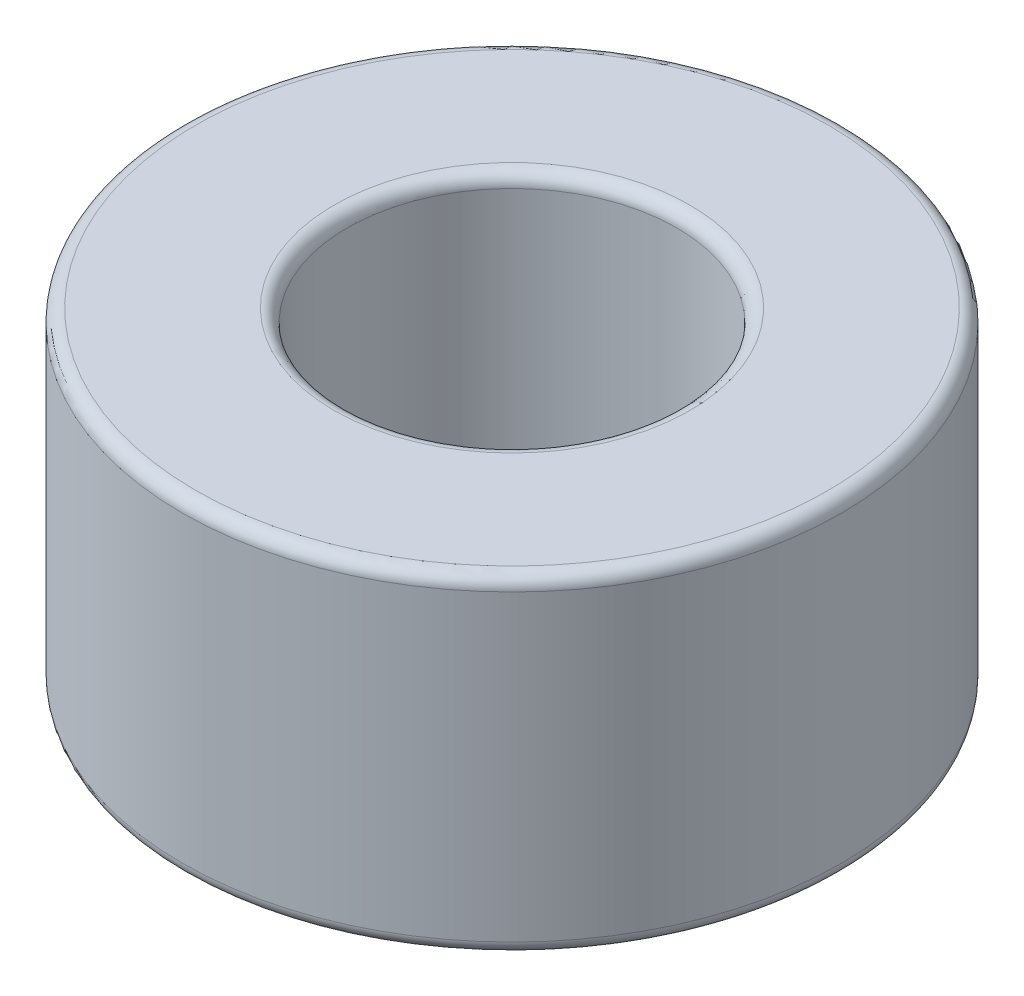
ISO-10303-21;
HEADER;
FILE_DESCRIPTION(('STEP AP214'),'2;1');
FILE_NAME('part.step','',(''),(''),'','','');
FILE_SCHEMA(('AUTOMOTIVE_DESIGN { 1 0 10303 214 1 1 1 1 }'));
ENDSEC;
DATA;
#1=APPLICATION_CONTEXT('core data for automotive mechanical design processes');
#2=APPLICATION_PROTOCOL_DEFINITION('international standard','automotive_design',2000,#1);
#3=PRODUCT_CONTEXT('',#1,'mechanical');
#4=PRODUCT('Part','Part','',(#3));
#5=PRODUCT_RELATED_PRODUCT_CATEGORY('part','',(#4));
#6=PRODUCT_DEFINITION_FORMATION('','',#4);
#7=PRODUCT_DEFINITION_CONTEXT('part definition',#1,'design');
#8=PRODUCT_DEFINITION('design','',#6,#7);
#9=PRODUCT_DEFINITION_SHAPE('','',#8);
#10=(LENGTH_UNIT() NAMED_UNIT(*) SI_UNIT(.MILLI.,.METRE.));
#11=(NAMED_UNIT(*) PLANE_ANGLE_UNIT() SI_UNIT($,.RADIAN.));
#12=(NAMED_UNIT(*) SI_UNIT($,.STERADIAN.) SOLID_ANGLE_UNIT());
#13=UNCERTAINTY_MEASURE_WITH_UNIT(LENGTH_MEASURE(1.E-05),#10,'distance_accuracy_value','');
#14=(GEOMETRIC_REPRESENTATION_CONTEXT(3) GLOBAL_UNCERTAINTY_ASSIGNED_CONTEXT((#13)) GLOBAL_UNIT_ASSIGNED_CONTEXT((#10,
#11,#12)) REPRESENTATION_CONTEXT('',''));
#15=CARTESIAN_POINT('',(0.,0.,0.));
#16=DIRECTION('',(0.,0.,1.));
#17=DIRECTION('',(1.,0.,0.));
#18=AXIS2_PLACEMENT_3D('',#15,#16,#17);
#19=CARTESIAN_POINT('',(0.,1.5875,0.));
#20=DIRECTION('',(0.,1.,0.));
#21=DIRECTION('',(0.,0.,1.));
#22=AXIS2_PLACEMENT_3D('',#19,#20,#21);
#23=PLANE('',#22);
#24=CARTESIAN_POINT('',(0.,1.5875,0.));
#25=DIRECTION('',(0.,1.,0.));
#26=DIRECTION('',(0.,0.,1.));
#27=AXIS2_PLACEMENT_3D('',#24,#25,#26);
#28=CIRCLE('',#27,1.7145);
#29=CARTESIAN_POINT('',(0.,1.5875,1.7145));
#30=VERTEX_POINT('',#29);
#31=EDGE_CURVE('E46',#30,#30,#28,.F.);
#32=ORIENTED_EDGE('',*,*,#31,.T.);
#33=EDGE_LOOP('',(#32));
#34=FACE_BOUND('',#33,.T.);
#35=CARTESIAN_POINT('',(0.,1.5875,0.));
#36=DIRECTION('',(0.,1.,0.));
#37=DIRECTION('',(0.,0.,1.));
#38=AXIS2_PLACEMENT_3D('',#35,#36,#37);
#39=CIRCLE('',#38,3.048);
#40=CARTESIAN_POINT('',(0.,1.5875,3.048));
#41=VERTEX_POINT('',#40);
#42=EDGE_CURVE('E50',#41,#41,#39,.T.);
#43=ORIENTED_EDGE('',*,*,#42,.T.);
#44=EDGE_LOOP('',(#43));
#45=FACE_BOUND('',#44,.T.);
#46=ADVANCED_FACE('F35',(#34,#45),#23,.T.);
#47=CARTESIAN_POINT('',(0.,-1.5875,0.));
#48=DIRECTION('',(0.,1.,0.));
#49=DIRECTION('',(0.,0.,1.));
#50=AXIS2_PLACEMENT_3D('',#47,#48,#49);
#51=PLANE('',#50);
#52=CARTESIAN_POINT('',(0.,-1.5875,0.));
#53=DIRECTION('',(0.,1.,0.));
#54=DIRECTION('',(0.,0.,1.));
#55=AXIS2_PLACEMENT_3D('',#52,#53,#54);
#56=CIRCLE('',#55,1.7145);
#57=CARTESIAN_POINT('',(0.,-1.5875,1.7145));
#58=VERTEX_POINT('',#57);
#59=EDGE_CURVE('E61',#58,#58,#56,.T.);
#60=ORIENTED_EDGE('',*,*,#59,.T.);
#61=EDGE_LOOP('',(#60));
#62=FACE_BOUND('',#61,.T.);
#63=CARTESIAN_POINT('',(0.,-1.5875,0.));
#64=DIRECTION('',(0.,1.,0.));
#65=DIRECTION('',(0.,0.,1.));
#66=AXIS2_PLACEMENT_3D('',#63,#64,#65);
#67=CIRCLE('',#66,3.048);
#68=CARTESIAN_POINT('',(0.,-1.5875,3.048));
#69=VERTEX_POINT('',#68);
#70=EDGE_CURVE('E64',#69,#69,#67,.F.);
#71=ORIENTED_EDGE('',*,*,#70,.T.);
#72=EDGE_LOOP('',(#71));
#73=FACE_BOUND('',#72,.T.);
#74=ADVANCED_FACE('F68',(#62,#73),#51,.F.);
#75=CARTESIAN_POINT('',(0.,1.5875,0.));
#76=DIRECTION('',(0.,-1.,0.));
#77=DIRECTION('',(0.,0.,-1.));
#78=AXIS2_PLACEMENT_3D('',#75,#76,#77);
#79=CYLINDRICAL_SURFACE('',#78,3.175);
#80=CARTESIAN_POINT('',(0.,-1.4605,0.));
#81=DIRECTION('',(0.,1.,0.));
#82=DIRECTION('',(0.,0.,1.));
#83=AXIS2_PLACEMENT_3D('',#80,#81,#82);
#84=CIRCLE('',#83,3.175);
#85=CARTESIAN_POINT('',(0.,-1.4605,3.175));
#86=VERTEX_POINT('',#85);
#87=EDGE_CURVE('E10',#86,#86,#84,.T.);
#88=ORIENTED_EDGE('',*,*,#87,.T.);
#89=EDGE_LOOP('',(#88));
#90=FACE_BOUND('',#89,.T.);
#91=CARTESIAN_POINT('',(0.,1.4605,0.));
#92=DIRECTION('',(0.,1.,0.));
#93=DIRECTION('',(0.,0.,1.));
#94=AXIS2_PLACEMENT_3D('',#91,#92,#93);
#95=CIRCLE('',#94,3.175);
#96=CARTESIAN_POINT('',(0.,1.4605,3.175));
#97=VERTEX_POINT('',#96);
#98=EDGE_CURVE('E42',#97,#97,#95,.F.);
#99=ORIENTED_EDGE('',*,*,#98,.T.);
#100=EDGE_LOOP('',(#99));
#101=FACE_BOUND('',#100,.T.);
#102=ADVANCED_FACE('F88',(#90,#101),#79,.T.);
#103=CARTESIAN_POINT('',(0.,1.5875,0.));
#104=DIRECTION('',(0.,-1.,0.));
#105=DIRECTION('',(0.,0.,-1.));
#106=AXIS2_PLACEMENT_3D('',#103,#104,#105);
#107=CYLINDRICAL_SURFACE('',#106,1.5875);
#108=CARTESIAN_POINT('',(0.,-1.4605,0.));
#109=DIRECTION('',(0.,1.,0.));
#110=DIRECTION('',(0.,0.,1.));
#111=AXIS2_PLACEMENT_3D('',#108,#109,#110);
#112=CIRCLE('',#111,1.5875);
#113=CARTESIAN_POINT('',(0.,-1.4605,1.5875));
#114=VERTEX_POINT('',#113);
#115=EDGE_CURVE('E55',#114,#114,#112,.F.);
#116=ORIENTED_EDGE('',*,*,#115,.T.);
#117=EDGE_LOOP('',(#116));
#118=FACE_BOUND('',#117,.T.);
#119=CARTESIAN_POINT('',(0.,1.4605,0.));
#120=DIRECTION('',(0.,1.,0.));
#121=DIRECTION('',(0.,0.,1.));
#122=AXIS2_PLACEMENT_3D('',#119,#120,#121);
#123=CIRCLE('',#122,1.5875);
#124=CARTESIAN_POINT('',(0.,1.4605,1.5875));
#125=VERTEX_POINT('',#124);
#126=EDGE_CURVE('E58',#125,#125,#123,.T.);
#127=ORIENTED_EDGE('',*,*,#126,.T.);
#128=EDGE_LOOP('',(#127));
#129=FACE_BOUND('',#128,.T.);
#130=ADVANCED_FACE('F93',(#118,#129),#107,.F.);
#131=CARTESIAN_POINT('',(0.,-1.4605,0.));
#132=DIRECTION('',(0.,1.,0.));
#133=DIRECTION('',(0.,0.,1.));
#134=AXIS2_PLACEMENT_3D('',#131,#132,#133);
#135=TOROIDAL_SURFACE('',#134,1.7145,0.127);
#136=ORIENTED_EDGE('',*,*,#115,.F.);
#137=EDGE_LOOP('',(#136));
#138=FACE_BOUND('',#137,.T.);
#139=ORIENTED_EDGE('',*,*,#59,.F.);
#140=EDGE_LOOP('',(#139));
#141=FACE_BOUND('',#140,.T.);
#142=ADVANCED_FACE('F79',(#138,#141),#135,.T.);
#143=CARTESIAN_POINT('',(0.,1.4605,0.));
#144=DIRECTION('',(0.,1.,0.));
#145=DIRECTION('',(0.,0.,1.));
#146=AXIS2_PLACEMENT_3D('',#143,#144,#145);
#147=TOROIDAL_SURFACE('',#146,1.7145,0.127);
#148=ORIENTED_EDGE('',*,*,#31,.F.);
#149=EDGE_LOOP('',(#148));
#150=FACE_BOUND('',#149,.T.);
#151=ORIENTED_EDGE('',*,*,#126,.F.);
#152=EDGE_LOOP('',(#151));
#153=FACE_BOUND('',#152,.T.);
#154=ADVANCED_FACE('F73',(#150,#153),#147,.T.);
#155=CARTESIAN_POINT('',(0.,-1.4605,0.));
#156=DIRECTION('',(0.,1.,0.));
#157=DIRECTION('',(0.,0.,1.));
#158=AXIS2_PLACEMENT_3D('',#155,#156,#157);
#159=TOROIDAL_SURFACE('',#158,3.048,0.127);
#160=ORIENTED_EDGE('',*,*,#70,.F.);
#161=EDGE_LOOP('',(#160));
#162=FACE_BOUND('',#161,.T.);
#163=ORIENTED_EDGE('',*,*,#87,.F.);
#164=EDGE_LOOP('',(#163));
#165=FACE_BOUND('',#164,.T.);
#166=ADVANCED_FACE('F70',(#162,#165),#159,.T.);
#167=CARTESIAN_POINT('',(0.,1.4605,0.));
#168=DIRECTION('',(0.,1.,0.));
#169=DIRECTION('',(0.,0.,1.));
#170=AXIS2_PLACEMENT_3D('',#167,#168,#169);
#171=TOROIDAL_SURFACE('',#170,3.048,0.127);
#172=ORIENTED_EDGE('',*,*,#98,.F.);
#173=EDGE_LOOP('',(#172));
#174=FACE_BOUND('',#173,.T.);
#175=ORIENTED_EDGE('',*,*,#42,.F.);
#176=EDGE_LOOP('',(#175));
#177=FACE_BOUND('',#176,.T.);
#178=ADVANCED_FACE('F37',(#174,#177),#171,.T.);
#179=CLOSED_SHELL('',(#46,#74,#102,#130,#142,#154,#166,#178));
#180=MANIFOLD_SOLID_BREP('B2',#179);
#181=ADVANCED_BREP_SHAPE_REPRESENTATION('',(#18,#180),#14);
#182=SHAPE_DEFINITION_REPRESENTATION(#9,#181);
ENDSEC;
END-ISO-10303-21;
